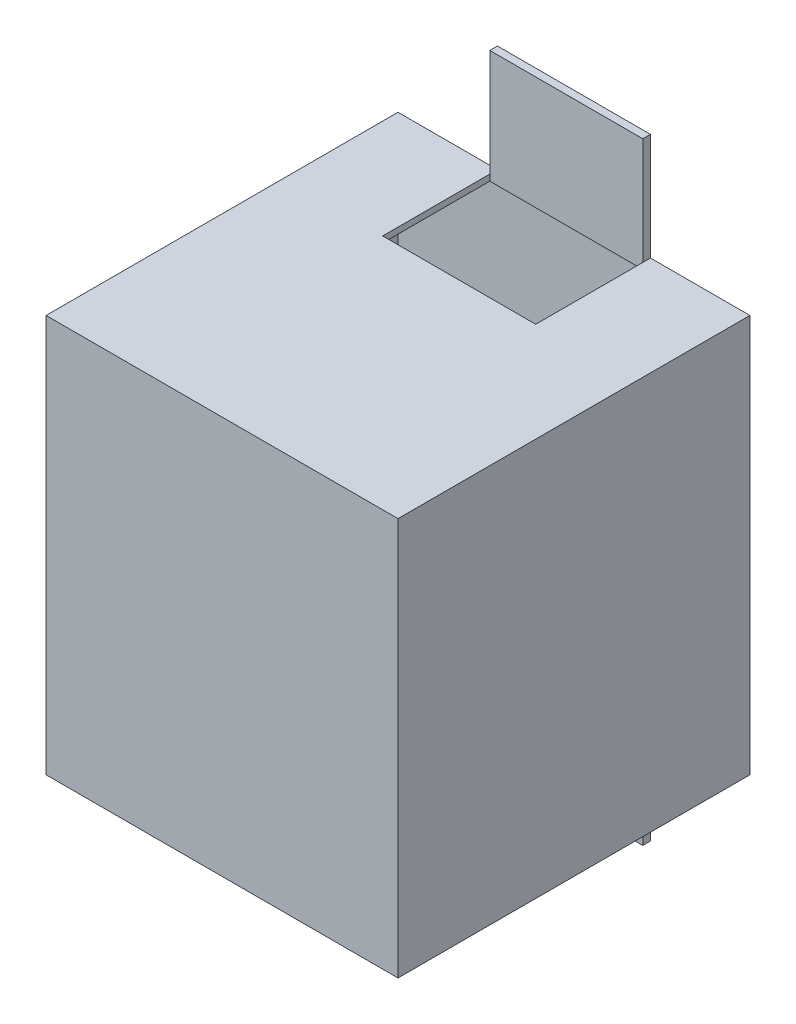
ISO-10303-21;
HEADER;
FILE_DESCRIPTION(('STEP AP214'),'2;1');
FILE_NAME('part.step','',(''),(''),'','','');
FILE_SCHEMA(('AUTOMOTIVE_DESIGN { 1 0 10303 214 1 1 1 1 }'));
ENDSEC;
DATA;
#1=APPLICATION_CONTEXT('core data for automotive mechanical design processes');
#2=APPLICATION_PROTOCOL_DEFINITION('international standard','automotive_design',2000,#1);
#3=PRODUCT_CONTEXT('',#1,'mechanical');
#4=PRODUCT('Part','Part','',(#3));
#5=PRODUCT_RELATED_PRODUCT_CATEGORY('part','',(#4));
#6=PRODUCT_DEFINITION_FORMATION('','',#4);
#7=PRODUCT_DEFINITION_CONTEXT('part definition',#1,'design');
#8=PRODUCT_DEFINITION('design','',#6,#7);
#9=PRODUCT_DEFINITION_SHAPE('','',#8);
#10=(LENGTH_UNIT() NAMED_UNIT(*) SI_UNIT(.MILLI.,.METRE.));
#11=(NAMED_UNIT(*) PLANE_ANGLE_UNIT() SI_UNIT($,.RADIAN.));
#12=(NAMED_UNIT(*) SI_UNIT($,.STERADIAN.) SOLID_ANGLE_UNIT());
#13=UNCERTAINTY_MEASURE_WITH_UNIT(LENGTH_MEASURE(1.E-05),#10,'distance_accuracy_value','');
#14=(GEOMETRIC_REPRESENTATION_CONTEXT(3) GLOBAL_UNCERTAINTY_ASSIGNED_CONTEXT((#13)) GLOBAL_UNIT_ASSIGNED_CONTEXT((#10,
#11,#12)) REPRESENTATION_CONTEXT('',''));
#15=CARTESIAN_POINT('',(0.,0.,0.));
#16=DIRECTION('',(0.,0.,1.));
#17=DIRECTION('',(1.,0.,0.));
#18=AXIS2_PLACEMENT_3D('',#15,#16,#17);
#19=CARTESIAN_POINT('',(0.,0.,230.));
#20=DIRECTION('',(0.,-1.,0.));
#21=DIRECTION('',(0.,0.,-1.));
#22=AXIS2_PLACEMENT_3D('',#19,#20,#21);
#23=PLANE('',#22);
#24=DIRECTION('',(0.,0.,-1.));
#25=VECTOR('',#24,1.);
#26=CARTESIAN_POINT('',(165.,0.,5.));
#27=LINE('',#26,#25);
#28=CARTESIAN_POINT('',(165.,0.,5.));
#29=VERTEX_POINT('',#28);
#30=CARTESIAN_POINT('',(165.,0.,0.));
#31=VERTEX_POINT('',#30);
#32=EDGE_CURVE('E212',#29,#31,#27,.T.);
#33=ORIENTED_EDGE('',*,*,#32,.F.);
#34=DIRECTION('',(0.,0.,1.));
#35=VECTOR('',#34,1.);
#36=CARTESIAN_POINT('',(165.,0.,230.));
#37=LINE('',#36,#35);
#38=CARTESIAN_POINT('',(165.,0.,75.));
#39=VERTEX_POINT('',#38);
#40=EDGE_CURVE('E295',#29,#39,#37,.T.);
#41=ORIENTED_EDGE('',*,*,#40,.T.);
#42=DIRECTION('',(-1.,0.,0.));
#43=VECTOR('',#42,1.);
#44=CARTESIAN_POINT('',(0.,0.,75.));
#45=LINE('',#44,#43);
#46=CARTESIAN_POINT('',(65.,0.,75.));
#47=VERTEX_POINT('',#46);
#48=EDGE_CURVE('E303',#39,#47,#45,.T.);
#49=ORIENTED_EDGE('',*,*,#48,.T.);
#50=DIRECTION('',(0.,0.,-1.));
#51=VECTOR('',#50,1.);
#52=CARTESIAN_POINT('',(65.,0.,230.));
#53=LINE('',#52,#51);
#54=CARTESIAN_POINT('',(65.,0.,5.));
#55=VERTEX_POINT('',#54);
#56=EDGE_CURVE('E311',#47,#55,#53,.T.);
#57=ORIENTED_EDGE('',*,*,#56,.T.);
#58=DIRECTION('',(0.,0.,1.));
#59=VECTOR('',#58,1.);
#60=CARTESIAN_POINT('',(65.,0.,5.));
#61=LINE('',#60,#59);
#62=CARTESIAN_POINT('',(65.,0.,0.));
#63=VERTEX_POINT('',#62);
#64=EDGE_CURVE('E54',#63,#55,#61,.T.);
#65=ORIENTED_EDGE('',*,*,#64,.F.);
#66=DIRECTION('',(-1.,0.,0.));
#67=VECTOR('',#66,1.);
#68=CARTESIAN_POINT('',(0.,0.,0.));
#69=LINE('',#68,#67);
#70=CARTESIAN_POINT('',(0.,0.,0.));
#71=VERTEX_POINT('',#70);
#72=EDGE_CURVE('E380',#63,#71,#69,.T.);
#73=ORIENTED_EDGE('',*,*,#72,.T.);
#74=DIRECTION('',(0.,0.,-1.));
#75=VECTOR('',#74,1.);
#76=CARTESIAN_POINT('',(0.,0.,230.));
#77=LINE('',#76,#75);
#78=CARTESIAN_POINT('',(0.,0.,230.));
#79=VERTEX_POINT('',#78);
#80=EDGE_CURVE('E370',#79,#71,#77,.T.);
#81=ORIENTED_EDGE('',*,*,#80,.F.);
#82=DIRECTION('',(-1.,0.,0.));
#83=VECTOR('',#82,1.);
#84=CARTESIAN_POINT('',(0.,0.,230.));
#85=LINE('',#84,#83);
#86=CARTESIAN_POINT('',(230.,0.,230.));
#87=VERTEX_POINT('',#86);
#88=EDGE_CURVE('E367',#87,#79,#85,.T.);
#89=ORIENTED_EDGE('',*,*,#88,.F.);
#90=DIRECTION('',(0.,0.,-1.));
#91=VECTOR('',#90,1.);
#92=CARTESIAN_POINT('',(230.,0.,230.));
#93=LINE('',#92,#91);
#94=CARTESIAN_POINT('',(230.,0.,0.));
#95=VERTEX_POINT('',#94);
#96=EDGE_CURVE('E386',#87,#95,#93,.T.);
#97=ORIENTED_EDGE('',*,*,#96,.T.);
#98=EDGE_CURVE('E61',#95,#31,#69,.T.);
#99=ORIENTED_EDGE('',*,*,#98,.T.);
#100=EDGE_LOOP('',(#33,#41,#49,#57,#65,#73,#81,#89,#97,#99));
#101=FACE_BOUND('',#100,.T.);
#102=ADVANCED_FACE('F38',(#101),#23,.F.);
#103=CARTESIAN_POINT('',(0.,-260.,230.));
#104=DIRECTION('',(0.,1.,0.));
#105=DIRECTION('',(0.,0.,1.));
#106=AXIS2_PLACEMENT_3D('',#103,#104,#105);
#107=PLANE('',#106);
#108=DIRECTION('',(0.,0.,1.));
#109=VECTOR('',#108,1.);
#110=CARTESIAN_POINT('',(165.,-260.,0.));
#111=LINE('',#110,#109);
#112=CARTESIAN_POINT('',(165.,-260.,0.));
#113=VERTEX_POINT('',#112);
#114=CARTESIAN_POINT('',(165.,-260.,5.));
#115=VERTEX_POINT('',#114);
#116=EDGE_CURVE('E214',#113,#115,#111,.T.);
#117=ORIENTED_EDGE('',*,*,#116,.F.);
#118=DIRECTION('',(1.,0.,0.));
#119=VECTOR('',#118,1.);
#120=CARTESIAN_POINT('',(0.,-260.,0.));
#121=LINE('',#120,#119);
#122=CARTESIAN_POINT('',(230.,-260.,0.));
#123=VERTEX_POINT('',#122);
#124=EDGE_CURVE('E373',#113,#123,#121,.T.);
#125=ORIENTED_EDGE('',*,*,#124,.T.);
#126=DIRECTION('',(0.,0.,-1.));
#127=VECTOR('',#126,1.);
#128=CARTESIAN_POINT('',(230.,-260.,230.));
#129=LINE('',#128,#127);
#130=CARTESIAN_POINT('',(230.,-260.,230.));
#131=VERTEX_POINT('',#130);
#132=EDGE_CURVE('E389',#131,#123,#129,.T.);
#133=ORIENTED_EDGE('',*,*,#132,.F.);
#134=DIRECTION('',(1.,0.,0.));
#135=VECTOR('',#134,1.);
#136=CARTESIAN_POINT('',(0.,-260.,230.));
#137=LINE('',#136,#135);
#138=CARTESIAN_POINT('',(0.,-260.,230.));
#139=VERTEX_POINT('',#138);
#140=EDGE_CURVE('E361',#139,#131,#137,.T.);
#141=ORIENTED_EDGE('',*,*,#140,.F.);
#142=DIRECTION('',(0.,0.,-1.));
#143=VECTOR('',#142,1.);
#144=CARTESIAN_POINT('',(0.,-260.,230.));
#145=LINE('',#144,#143);
#146=CARTESIAN_POINT('',(0.,-260.,0.));
#147=VERTEX_POINT('',#146);
#148=EDGE_CURVE('E393',#139,#147,#145,.T.);
#149=ORIENTED_EDGE('',*,*,#148,.T.);
#150=CARTESIAN_POINT('',(65.,-260.,0.));
#151=VERTEX_POINT('',#150);
#152=EDGE_CURVE('E374',#147,#151,#121,.T.);
#153=ORIENTED_EDGE('',*,*,#152,.T.);
#154=DIRECTION('',(0.,0.,-1.));
#155=VECTOR('',#154,1.);
#156=CARTESIAN_POINT('',(65.,-260.,0.));
#157=LINE('',#156,#155);
#158=CARTESIAN_POINT('',(65.,-260.,5.));
#159=VERTEX_POINT('',#158);
#160=EDGE_CURVE('E220',#159,#151,#157,.T.);
#161=ORIENTED_EDGE('',*,*,#160,.F.);
#162=DIRECTION('',(0.,0.,-1.));
#163=VECTOR('',#162,1.);
#164=CARTESIAN_POINT('',(65.,-260.,75.));
#165=LINE('',#164,#163);
#166=CARTESIAN_POINT('',(65.,-260.,75.));
#167=VERTEX_POINT('',#166);
#168=EDGE_CURVE('E258',#167,#159,#165,.T.);
#169=ORIENTED_EDGE('',*,*,#168,.F.);
#170=DIRECTION('',(-1.,0.,0.));
#171=VECTOR('',#170,1.);
#172=CARTESIAN_POINT('',(65.,-260.,75.));
#173=LINE('',#172,#171);
#174=CARTESIAN_POINT('',(165.,-260.,75.));
#175=VERTEX_POINT('',#174);
#176=EDGE_CURVE('E266',#175,#167,#173,.T.);
#177=ORIENTED_EDGE('',*,*,#176,.F.);
#178=DIRECTION('',(0.,0.,1.));
#179=VECTOR('',#178,1.);
#180=CARTESIAN_POINT('',(165.,-260.,75.));
#181=LINE('',#180,#179);
#182=EDGE_CURVE('E262',#115,#175,#181,.T.);
#183=ORIENTED_EDGE('',*,*,#182,.F.);
#184=EDGE_LOOP('',(#117,#125,#133,#141,#149,#153,#161,#169,#177,#183));
#185=FACE_BOUND('',#184,.T.);
#186=ADVANCED_FACE('F504',(#185),#107,.F.);
#187=CARTESIAN_POINT('',(0.,-256.,0.));
#188=DIRECTION('',(0.,-1.,0.));
#189=DIRECTION('',(0.,0.,-1.));
#190=AXIS2_PLACEMENT_3D('',#187,#188,#189);
#191=PLANE('',#190);
#192=DIRECTION('',(-1.,0.,0.));
#193=VECTOR('',#192,1.);
#194=CARTESIAN_POINT('',(0.,-256.,75.));
#195=LINE('',#194,#193);
#196=CARTESIAN_POINT('',(165.,-256.,75.));
#197=VERTEX_POINT('',#196);
#198=CARTESIAN_POINT('',(65.,-256.,75.));
#199=VERTEX_POINT('',#198);
#200=EDGE_CURVE('E299',#197,#199,#195,.T.);
#201=ORIENTED_EDGE('',*,*,#200,.T.);
#202=DIRECTION('',(0.,0.,-1.));
#203=VECTOR('',#202,1.);
#204=CARTESIAN_POINT('',(65.,-256.,0.));
#205=LINE('',#204,#203);
#206=CARTESIAN_POINT('',(65.,-256.,5.));
#207=VERTEX_POINT('',#206);
#208=EDGE_CURVE('E307',#199,#207,#205,.T.);
#209=ORIENTED_EDGE('',*,*,#208,.T.);
#210=DIRECTION('',(1.,0.,0.));
#211=VECTOR('',#210,1.);
#212=CARTESIAN_POINT('',(0.,-256.,5.));
#213=LINE('',#212,#211);
#214=CARTESIAN_POINT('',(165.,-256.,5.));
#215=VERTEX_POINT('',#214);
#216=EDGE_CURVE('E287',#207,#215,#213,.T.);
#217=ORIENTED_EDGE('',*,*,#216,.T.);
#218=DIRECTION('',(0.,0.,1.));
#219=VECTOR('',#218,1.);
#220=CARTESIAN_POINT('',(165.,-256.,0.));
#221=LINE('',#220,#219);
#222=EDGE_CURVE('E291',#215,#197,#221,.T.);
#223=ORIENTED_EDGE('',*,*,#222,.T.);
#224=EDGE_LOOP('',(#201,#209,#217,#223));
#225=FACE_BOUND('',#224,.T.);
#226=DIRECTION('',(1.,0.,0.));
#227=VECTOR('',#226,1.);
#228=CARTESIAN_POINT('',(226.,-256.,226.));
#229=LINE('',#228,#227);
#230=CARTESIAN_POINT('',(4.00000000000003,-256.,226.));
#231=VERTEX_POINT('',#230);
#232=CARTESIAN_POINT('',(226.,-256.,226.));
#233=VERTEX_POINT('',#232);
#234=EDGE_CURVE('E397',#231,#233,#229,.T.);
#235=ORIENTED_EDGE('',*,*,#234,.T.);
#236=DIRECTION('',(0.,0.,-1.));
#237=VECTOR('',#236,1.);
#238=CARTESIAN_POINT('',(226.,-256.,4.));
#239=LINE('',#238,#237);
#240=CARTESIAN_POINT('',(226.,-256.,4.));
#241=VERTEX_POINT('',#240);
#242=EDGE_CURVE('E322',#233,#241,#239,.T.);
#243=ORIENTED_EDGE('',*,*,#242,.T.);
#244=DIRECTION('',(-1.,0.,0.));
#245=VECTOR('',#244,1.);
#246=CARTESIAN_POINT('',(226.,-256.,4.));
#247=LINE('',#246,#245);
#248=CARTESIAN_POINT('',(4.00000000000003,-256.,3.99999999999997));
#249=VERTEX_POINT('',#248);
#250=EDGE_CURVE('E318',#241,#249,#247,.T.);
#251=ORIENTED_EDGE('',*,*,#250,.T.);
#252=DIRECTION('',(0.,0.,1.));
#253=VECTOR('',#252,1.);
#254=CARTESIAN_POINT('',(4.00000000000003,-256.,3.99999999999997));
#255=LINE('',#254,#253);
#256=EDGE_CURVE('E314',#249,#231,#255,.T.);
#257=ORIENTED_EDGE('',*,*,#256,.T.);
#258=EDGE_LOOP('',(#235,#243,#251,#257));
#259=FACE_BOUND('',#258,.T.);
#260=ADVANCED_FACE('F528',(#225,#259),#191,.F.);
#261=CARTESIAN_POINT('',(0.,-4.,0.));
#262=DIRECTION('',(0.,-1.,0.));
#263=DIRECTION('',(0.,0.,-1.));
#264=AXIS2_PLACEMENT_3D('',#261,#262,#263);
#265=PLANE('',#264);
#266=DIRECTION('',(0.,0.,-1.));
#267=VECTOR('',#266,1.);
#268=CARTESIAN_POINT('',(65.,-4.,0.));
#269=LINE('',#268,#267);
#270=CARTESIAN_POINT('',(65.,-4.,75.));
#271=VERTEX_POINT('',#270);
#272=CARTESIAN_POINT('',(65.,-4.,5.));
#273=VERTEX_POINT('',#272);
#274=EDGE_CURVE('E11',#271,#273,#269,.T.);
#275=ORIENTED_EDGE('',*,*,#274,.F.);
#276=DIRECTION('',(-1.,0.,0.));
#277=VECTOR('',#276,1.);
#278=CARTESIAN_POINT('',(0.,-4.,75.));
#279=LINE('',#278,#277);
#280=CARTESIAN_POINT('',(165.,-4.,75.));
#281=VERTEX_POINT('',#280);
#282=EDGE_CURVE('E47',#281,#271,#279,.T.);
#283=ORIENTED_EDGE('',*,*,#282,.F.);
#284=DIRECTION('',(0.,0.,1.));
#285=VECTOR('',#284,1.);
#286=CARTESIAN_POINT('',(165.,-4.,0.));
#287=LINE('',#286,#285);
#288=CARTESIAN_POINT('',(165.,-4.,5.));
#289=VERTEX_POINT('',#288);
#290=EDGE_CURVE('E404',#289,#281,#287,.T.);
#291=ORIENTED_EDGE('',*,*,#290,.F.);
#292=DIRECTION('',(1.,0.,0.));
#293=VECTOR('',#292,1.);
#294=CARTESIAN_POINT('',(0.,-4.,5.));
#295=LINE('',#294,#293);
#296=EDGE_CURVE('E401',#273,#289,#295,.T.);
#297=ORIENTED_EDGE('',*,*,#296,.F.);
#298=EDGE_LOOP('',(#275,#283,#291,#297));
#299=FACE_BOUND('',#298,.T.);
#300=DIRECTION('',(0.,0.,1.));
#301=VECTOR('',#300,1.);
#302=CARTESIAN_POINT('',(226.,-4.,4.));
#303=LINE('',#302,#301);
#304=CARTESIAN_POINT('',(226.,-4.,4.));
#305=VERTEX_POINT('',#304);
#306=CARTESIAN_POINT('',(226.,-4.,226.));
#307=VERTEX_POINT('',#306);
#308=EDGE_CURVE('E326',#305,#307,#303,.T.);
#309=ORIENTED_EDGE('',*,*,#308,.T.);
#310=DIRECTION('',(-1.,0.,0.));
#311=VECTOR('',#310,1.);
#312=CARTESIAN_POINT('',(226.,-4.,226.));
#313=LINE('',#312,#311);
#314=CARTESIAN_POINT('',(4.00000000000003,-4.,226.));
#315=VERTEX_POINT('',#314);
#316=EDGE_CURVE('E330',#307,#315,#313,.T.);
#317=ORIENTED_EDGE('',*,*,#316,.T.);
#318=DIRECTION('',(0.,0.,-1.));
#319=VECTOR('',#318,1.);
#320=CARTESIAN_POINT('',(4.00000000000003,-4.,3.99999999999997));
#321=LINE('',#320,#319);
#322=CARTESIAN_POINT('',(4.00000000000003,-4.,3.99999999999997));
#323=VERTEX_POINT('',#322);
#324=EDGE_CURVE('E334',#315,#323,#321,.T.);
#325=ORIENTED_EDGE('',*,*,#324,.T.);
#326=DIRECTION('',(1.,0.,0.));
#327=VECTOR('',#326,1.);
#328=CARTESIAN_POINT('',(226.,-4.,4.));
#329=LINE('',#328,#327);
#330=EDGE_CURVE('E338',#323,#305,#329,.T.);
#331=ORIENTED_EDGE('',*,*,#330,.T.);
#332=EDGE_LOOP('',(#309,#317,#325,#331));
#333=FACE_BOUND('',#332,.T.);
#334=ADVANCED_FACE('F423',(#299,#333),#265,.T.);
#335=CARTESIAN_POINT('',(226.,-4.,226.));
#336=DIRECTION('',(0.,0.,1.));
#337=DIRECTION('',(1.,0.,0.));
#338=AXIS2_PLACEMENT_3D('',#335,#336,#337);
#339=PLANE('',#338);
#340=ORIENTED_EDGE('',*,*,#234,.F.);
#341=DIRECTION('',(0.,-1.,0.));
#342=VECTOR('',#341,1.);
#343=CARTESIAN_POINT('',(4.00000000000003,-4.,226.));
#344=LINE('',#343,#342);
#345=EDGE_CURVE('E352',#315,#231,#344,.T.);
#346=ORIENTED_EDGE('',*,*,#345,.F.);
#347=ORIENTED_EDGE('',*,*,#316,.F.);
#348=DIRECTION('',(0.,-1.,0.));
#349=VECTOR('',#348,1.);
#350=CARTESIAN_POINT('',(226.,-4.,226.));
#351=LINE('',#350,#349);
#352=EDGE_CURVE('E342',#307,#233,#351,.T.);
#353=ORIENTED_EDGE('',*,*,#352,.T.);
#354=EDGE_LOOP('',(#340,#346,#347,#353));
#355=FACE_BOUND('',#354,.T.);
#356=ADVANCED_FACE('F538',(#355),#339,.F.);
#357=CARTESIAN_POINT('',(4.00000000000003,-4.,3.99999999999997));
#358=DIRECTION('',(-1.,0.,0.));
#359=DIRECTION('',(0.,0.,1.));
#360=AXIS2_PLACEMENT_3D('',#357,#358,#359);
#361=PLANE('',#360);
#362=ORIENTED_EDGE('',*,*,#256,.F.);
#363=DIRECTION('',(0.,-1.,0.));
#364=VECTOR('',#363,1.);
#365=CARTESIAN_POINT('',(4.00000000000003,-4.,3.99999999999997));
#366=LINE('',#365,#364);
#367=EDGE_CURVE('E348',#323,#249,#366,.T.);
#368=ORIENTED_EDGE('',*,*,#367,.F.);
#369=ORIENTED_EDGE('',*,*,#324,.F.);
#370=ORIENTED_EDGE('',*,*,#345,.T.);
#371=EDGE_LOOP('',(#362,#368,#369,#370));
#372=FACE_BOUND('',#371,.T.);
#373=ADVANCED_FACE('F541',(#372),#361,.F.);
#374=CARTESIAN_POINT('',(226.,-4.,4.));
#375=DIRECTION('',(0.,0.,-1.));
#376=DIRECTION('',(-1.,0.,0.));
#377=AXIS2_PLACEMENT_3D('',#374,#375,#376);
#378=PLANE('',#377);
#379=ORIENTED_EDGE('',*,*,#250,.F.);
#380=DIRECTION('',(0.,-1.,0.));
#381=VECTOR('',#380,1.);
#382=CARTESIAN_POINT('',(226.,-4.,4.));
#383=LINE('',#382,#381);
#384=EDGE_CURVE('E343',#305,#241,#383,.T.);
#385=ORIENTED_EDGE('',*,*,#384,.F.);
#386=ORIENTED_EDGE('',*,*,#330,.F.);
#387=ORIENTED_EDGE('',*,*,#367,.T.);
#388=EDGE_LOOP('',(#379,#385,#386,#387));
#389=FACE_BOUND('',#388,.T.);
#390=ADVANCED_FACE('F536',(#389),#378,.F.);
#391=CARTESIAN_POINT('',(226.,-4.,4.));
#392=DIRECTION('',(1.,0.,0.));
#393=DIRECTION('',(0.,0.,-1.));
#394=AXIS2_PLACEMENT_3D('',#391,#392,#393);
#395=PLANE('',#394);
#396=ORIENTED_EDGE('',*,*,#242,.F.);
#397=ORIENTED_EDGE('',*,*,#352,.F.);
#398=ORIENTED_EDGE('',*,*,#308,.F.);
#399=ORIENTED_EDGE('',*,*,#384,.T.);
#400=EDGE_LOOP('',(#396,#397,#398,#399));
#401=FACE_BOUND('',#400,.T.);
#402=ADVANCED_FACE('F533',(#401),#395,.F.);
#403=CARTESIAN_POINT('',(65.,196.,5.));
#404=DIRECTION('',(0.,0.,-1.));
#405=DIRECTION('',(-1.,0.,0.));
#406=AXIS2_PLACEMENT_3D('',#403,#404,#405);
#407=PLANE('',#406);
#408=DIRECTION('',(0.,-1.,0.));
#409=VECTOR('',#408,1.);
#410=CARTESIAN_POINT('',(65.,196.,5.));
#411=LINE('',#410,#409);
#412=EDGE_CURVE('E283',#55,#273,#411,.T.);
#413=ORIENTED_EDGE('',*,*,#412,.T.);
#414=ORIENTED_EDGE('',*,*,#296,.T.);
#415=DIRECTION('',(0.,-1.,0.));
#416=VECTOR('',#415,1.);
#417=CARTESIAN_POINT('',(165.,196.,5.));
#418=LINE('',#417,#416);
#419=EDGE_CURVE('E279',#29,#289,#418,.T.);
#420=ORIENTED_EDGE('',*,*,#419,.F.);
#421=DIRECTION('',(0.,-1.,0.));
#422=VECTOR('',#421,1.);
#423=CARTESIAN_POINT('',(165.,70.,5.));
#424=LINE('',#423,#422);
#425=CARTESIAN_POINT('',(165.,70.,5.));
#426=VERTEX_POINT('',#425);
#427=EDGE_CURVE('E831',#426,#29,#424,.T.);
#428=ORIENTED_EDGE('',*,*,#427,.F.);
#429=DIRECTION('',(1.,0.,0.));
#430=VECTOR('',#429,1.);
#431=CARTESIAN_POINT('',(165.,70.,5.));
#432=LINE('',#431,#430);
#433=CARTESIAN_POINT('',(65.,70.,5.));
#434=VERTEX_POINT('',#433);
#435=EDGE_CURVE('E205',#434,#426,#432,.T.);
#436=ORIENTED_EDGE('',*,*,#435,.F.);
#437=DIRECTION('',(0.,-1.,0.));
#438=VECTOR('',#437,1.);
#439=CARTESIAN_POINT('',(65.,70.,5.));
#440=LINE('',#439,#438);
#441=EDGE_CURVE('E222',#434,#55,#440,.T.);
#442=ORIENTED_EDGE('',*,*,#441,.T.);
#443=EDGE_LOOP('',(#413,#414,#420,#428,#436,#442));
#444=FACE_BOUND('',#443,.T.);
#445=ADVANCED_FACE('F428',(#444),#407,.F.);
#446=CARTESIAN_POINT('',(165.,196.,75.));
#447=DIRECTION('',(1.,0.,0.));
#448=DIRECTION('',(0.,0.,-1.));
#449=AXIS2_PLACEMENT_3D('',#446,#447,#448);
#450=PLANE('',#449);
#451=ORIENTED_EDGE('',*,*,#419,.T.);
#452=ORIENTED_EDGE('',*,*,#290,.T.);
#453=DIRECTION('',(0.,-1.,0.));
#454=VECTOR('',#453,1.);
#455=CARTESIAN_POINT('',(165.,196.,75.));
#456=LINE('',#455,#454);
#457=EDGE_CURVE('E275',#39,#281,#456,.T.);
#458=ORIENTED_EDGE('',*,*,#457,.F.);
#459=ORIENTED_EDGE('',*,*,#40,.F.);
#460=EDGE_LOOP('',(#451,#452,#458,#459));
#461=FACE_BOUND('',#460,.T.);
#462=ADVANCED_FACE('F432',(#461),#450,.F.);
#463=CARTESIAN_POINT('',(65.,196.,75.));
#464=DIRECTION('',(0.,0.,1.));
#465=DIRECTION('',(1.,0.,0.));
#466=AXIS2_PLACEMENT_3D('',#463,#464,#465);
#467=PLANE('',#466);
#468=ORIENTED_EDGE('',*,*,#457,.T.);
#469=ORIENTED_EDGE('',*,*,#282,.T.);
#470=DIRECTION('',(0.,-1.,0.));
#471=VECTOR('',#470,1.);
#472=CARTESIAN_POINT('',(65.,196.,75.));
#473=LINE('',#472,#471);
#474=EDGE_CURVE('E274',#47,#271,#473,.T.);
#475=ORIENTED_EDGE('',*,*,#474,.F.);
#476=ORIENTED_EDGE('',*,*,#48,.F.);
#477=EDGE_LOOP('',(#468,#469,#475,#476));
#478=FACE_BOUND('',#477,.T.);
#479=ADVANCED_FACE('F413',(#478),#467,.F.);
#480=CARTESIAN_POINT('',(65.,196.,75.));
#481=DIRECTION('',(-1.,0.,0.));
#482=DIRECTION('',(0.,0.,1.));
#483=AXIS2_PLACEMENT_3D('',#480,#481,#482);
#484=PLANE('',#483);
#485=ORIENTED_EDGE('',*,*,#474,.T.);
#486=ORIENTED_EDGE('',*,*,#274,.T.);
#487=ORIENTED_EDGE('',*,*,#412,.F.);
#488=ORIENTED_EDGE('',*,*,#56,.F.);
#489=EDGE_LOOP('',(#485,#486,#487,#488));
#490=FACE_BOUND('',#489,.T.);
#491=ADVANCED_FACE('F419',(#490),#484,.F.);
#492=EDGE_CURVE('E271',#199,#167,#473,.T.);
#493=ORIENTED_EDGE('',*,*,#492,.T.);
#494=ORIENTED_EDGE('',*,*,#168,.T.);
#495=EDGE_CURVE('E270',#207,#159,#411,.T.);
#496=ORIENTED_EDGE('',*,*,#495,.F.);
#497=ORIENTED_EDGE('',*,*,#208,.F.);
#498=EDGE_LOOP('',(#493,#494,#496,#497));
#499=FACE_BOUND('',#498,.T.);
#500=ADVANCED_FACE('F556',(#499),#484,.F.);
#501=EDGE_CURVE('E276',#197,#175,#456,.T.);
#502=ORIENTED_EDGE('',*,*,#501,.T.);
#503=ORIENTED_EDGE('',*,*,#176,.T.);
#504=ORIENTED_EDGE('',*,*,#492,.F.);
#505=ORIENTED_EDGE('',*,*,#200,.F.);
#506=EDGE_LOOP('',(#502,#503,#504,#505));
#507=FACE_BOUND('',#506,.T.);
#508=ADVANCED_FACE('F564',(#507),#467,.F.);
#509=EDGE_CURVE('E280',#215,#115,#418,.T.);
#510=ORIENTED_EDGE('',*,*,#509,.T.);
#511=ORIENTED_EDGE('',*,*,#182,.T.);
#512=ORIENTED_EDGE('',*,*,#501,.F.);
#513=ORIENTED_EDGE('',*,*,#222,.F.);
#514=EDGE_LOOP('',(#510,#511,#512,#513));
#515=FACE_BOUND('',#514,.T.);
#516=ADVANCED_FACE('F561',(#515),#450,.F.);
#517=ORIENTED_EDGE('',*,*,#495,.T.);
#518=DIRECTION('',(0.,1.,0.));
#519=VECTOR('',#518,1.);
#520=CARTESIAN_POINT('',(65.,-330.,5.));
#521=LINE('',#520,#519);
#522=CARTESIAN_POINT('',(65.,-330.,5.));
#523=VERTEX_POINT('',#522);
#524=EDGE_CURVE('E250',#523,#159,#521,.T.);
#525=ORIENTED_EDGE('',*,*,#524,.F.);
#526=DIRECTION('',(-1.,0.,0.));
#527=VECTOR('',#526,1.);
#528=CARTESIAN_POINT('',(165.,-330.,5.));
#529=LINE('',#528,#527);
#530=CARTESIAN_POINT('',(165.,-330.,5.));
#531=VERTEX_POINT('',#530);
#532=EDGE_CURVE('E230',#531,#523,#529,.T.);
#533=ORIENTED_EDGE('',*,*,#532,.F.);
#534=DIRECTION('',(0.,1.,0.));
#535=VECTOR('',#534,1.);
#536=CARTESIAN_POINT('',(165.,-330.,5.));
#537=LINE('',#536,#535);
#538=EDGE_CURVE('E254',#531,#115,#537,.T.);
#539=ORIENTED_EDGE('',*,*,#538,.T.);
#540=ORIENTED_EDGE('',*,*,#509,.F.);
#541=ORIENTED_EDGE('',*,*,#216,.F.);
#542=EDGE_LOOP('',(#517,#525,#533,#539,#540,#541));
#543=FACE_BOUND('',#542,.T.);
#544=ADVANCED_FACE('F522',(#543),#407,.F.);
#545=CARTESIAN_POINT('',(0.,0.,230.));
#546=DIRECTION('',(1.,0.,0.));
#547=DIRECTION('',(0.,1.,0.));
#548=AXIS2_PLACEMENT_3D('',#545,#546,#547);
#549=PLANE('',#548);
#550=ORIENTED_EDGE('',*,*,#148,.F.);
#551=DIRECTION('',(0.,-1.,0.));
#552=VECTOR('',#551,1.);
#553=CARTESIAN_POINT('',(0.,0.,230.));
#554=LINE('',#553,#552);
#555=EDGE_CURVE('E358',#79,#139,#554,.T.);
#556=ORIENTED_EDGE('',*,*,#555,.F.);
#557=ORIENTED_EDGE('',*,*,#80,.T.);
#558=DIRECTION('',(0.,-1.,0.));
#559=VECTOR('',#558,1.);
#560=CARTESIAN_POINT('',(0.,0.,0.));
#561=LINE('',#560,#559);
#562=EDGE_CURVE('E347',#71,#147,#561,.T.);
#563=ORIENTED_EDGE('',*,*,#562,.T.);
#564=EDGE_LOOP('',(#550,#556,#557,#563));
#565=FACE_BOUND('',#564,.T.);
#566=ADVANCED_FACE('F40',(#565),#549,.F.);
#567=CARTESIAN_POINT('',(230.,0.,230.));
#568=DIRECTION('',(-1.,0.,0.));
#569=DIRECTION('',(0.,0.,1.));
#570=AXIS2_PLACEMENT_3D('',#567,#568,#569);
#571=PLANE('',#570);
#572=DIRECTION('',(0.,1.,0.));
#573=VECTOR('',#572,1.);
#574=CARTESIAN_POINT('',(230.,0.,0.));
#575=LINE('',#574,#573);
#576=EDGE_CURVE('E377',#123,#95,#575,.T.);
#577=ORIENTED_EDGE('',*,*,#576,.T.);
#578=ORIENTED_EDGE('',*,*,#96,.F.);
#579=DIRECTION('',(0.,1.,0.));
#580=VECTOR('',#579,1.);
#581=CARTESIAN_POINT('',(230.,0.,230.));
#582=LINE('',#581,#580);
#583=EDGE_CURVE('E364',#131,#87,#582,.T.);
#584=ORIENTED_EDGE('',*,*,#583,.F.);
#585=ORIENTED_EDGE('',*,*,#132,.T.);
#586=EDGE_LOOP('',(#577,#578,#584,#585));
#587=FACE_BOUND('',#586,.T.);
#588=ADVANCED_FACE('F514',(#587),#571,.F.);
#589=CARTESIAN_POINT('',(0.,0.,230.));
#590=DIRECTION('',(0.,0.,1.));
#591=DIRECTION('',(1.,0.,0.));
#592=AXIS2_PLACEMENT_3D('',#589,#590,#591);
#593=PLANE('',#592);
#594=ORIENTED_EDGE('',*,*,#583,.T.);
#595=ORIENTED_EDGE('',*,*,#88,.T.);
#596=ORIENTED_EDGE('',*,*,#555,.T.);
#597=ORIENTED_EDGE('',*,*,#140,.T.);
#598=EDGE_LOOP('',(#594,#595,#596,#597));
#599=FACE_BOUND('',#598,.T.);
#600=ADVANCED_FACE('F508',(#599),#593,.T.);
#601=CARTESIAN_POINT('',(0.,0.,0.));
#602=DIRECTION('',(0.,0.,1.));
#603=DIRECTION('',(1.,0.,0.));
#604=AXIS2_PLACEMENT_3D('',#601,#602,#603);
#605=PLANE('',#604);
#606=ORIENTED_EDGE('',*,*,#152,.F.);
#607=ORIENTED_EDGE('',*,*,#562,.F.);
#608=ORIENTED_EDGE('',*,*,#72,.F.);
#609=DIRECTION('',(0.,-1.,0.));
#610=VECTOR('',#609,1.);
#611=CARTESIAN_POINT('',(65.,70.,0.));
#612=LINE('',#611,#610);
#613=CARTESIAN_POINT('',(65.,70.,0.));
#614=VERTEX_POINT('',#613);
#615=EDGE_CURVE('E195',#614,#63,#612,.T.);
#616=ORIENTED_EDGE('',*,*,#615,.F.);
#617=DIRECTION('',(-1.,0.,0.));
#618=VECTOR('',#617,1.);
#619=CARTESIAN_POINT('',(165.,70.,0.));
#620=LINE('',#619,#618);
#621=CARTESIAN_POINT('',(165.,70.,0.));
#622=VERTEX_POINT('',#621);
#623=EDGE_CURVE('E187',#622,#614,#620,.T.);
#624=ORIENTED_EDGE('',*,*,#623,.F.);
#625=DIRECTION('',(0.,-1.,0.));
#626=VECTOR('',#625,1.);
#627=CARTESIAN_POINT('',(165.,70.,0.));
#628=LINE('',#627,#626);
#629=EDGE_CURVE('E192',#622,#31,#628,.T.);
#630=ORIENTED_EDGE('',*,*,#629,.T.);
#631=ORIENTED_EDGE('',*,*,#98,.F.);
#632=ORIENTED_EDGE('',*,*,#576,.F.);
#633=ORIENTED_EDGE('',*,*,#124,.F.);
#634=DIRECTION('',(0.,1.,0.));
#635=VECTOR('',#634,1.);
#636=CARTESIAN_POINT('',(165.,-330.,0.));
#637=LINE('',#636,#635);
#638=CARTESIAN_POINT('',(165.,-330.,0.));
#639=VERTEX_POINT('',#638);
#640=EDGE_CURVE('E238',#639,#113,#637,.T.);
#641=ORIENTED_EDGE('',*,*,#640,.F.);
#642=DIRECTION('',(1.,0.,0.));
#643=VECTOR('',#642,1.);
#644=CARTESIAN_POINT('',(165.,-330.,0.));
#645=LINE('',#644,#643);
#646=CARTESIAN_POINT('',(65.,-330.,0.));
#647=VERTEX_POINT('',#646);
#648=EDGE_CURVE('E236',#647,#639,#645,.T.);
#649=ORIENTED_EDGE('',*,*,#648,.F.);
#650=DIRECTION('',(0.,1.,0.));
#651=VECTOR('',#650,1.);
#652=CARTESIAN_POINT('',(65.,-330.,0.));
#653=LINE('',#652,#651);
#654=EDGE_CURVE('E246',#647,#151,#653,.T.);
#655=ORIENTED_EDGE('',*,*,#654,.T.);
#656=EDGE_LOOP('',(#606,#607,#608,#616,#624,#630,#631,#632,#633,#641,#649,#655));
#657=FACE_BOUND('',#656,.T.);
#658=ADVANCED_FACE('F190',(#657),#605,.F.);
#659=CARTESIAN_POINT('',(165.,-330.,0.));
#660=DIRECTION('',(-1.,0.,0.));
#661=DIRECTION('',(0.,0.,1.));
#662=AXIS2_PLACEMENT_3D('',#659,#660,#661);
#663=PLANE('',#662);
#664=ORIENTED_EDGE('',*,*,#116,.T.);
#665=ORIENTED_EDGE('',*,*,#538,.F.);
#666=DIRECTION('',(0.,0.,1.));
#667=VECTOR('',#666,1.);
#668=CARTESIAN_POINT('',(165.,-330.,0.));
#669=LINE('',#668,#667);
#670=EDGE_CURVE('E226',#639,#531,#669,.T.);
#671=ORIENTED_EDGE('',*,*,#670,.F.);
#672=ORIENTED_EDGE('',*,*,#640,.T.);
#673=EDGE_LOOP('',(#664,#665,#671,#672));
#674=FACE_BOUND('',#673,.T.);
#675=ADVANCED_FACE('F531',(#674),#663,.F.);
#676=CARTESIAN_POINT('',(65.,-330.,0.));
#677=DIRECTION('',(1.,0.,0.));
#678=DIRECTION('',(0.,0.,-1.));
#679=AXIS2_PLACEMENT_3D('',#676,#677,#678);
#680=PLANE('',#679);
#681=ORIENTED_EDGE('',*,*,#160,.T.);
#682=ORIENTED_EDGE('',*,*,#654,.F.);
#683=DIRECTION('',(0.,0.,-1.));
#684=VECTOR('',#683,1.);
#685=CARTESIAN_POINT('',(65.,-330.,0.));
#686=LINE('',#685,#684);
#687=EDGE_CURVE('E233',#523,#647,#686,.T.);
#688=ORIENTED_EDGE('',*,*,#687,.F.);
#689=ORIENTED_EDGE('',*,*,#524,.T.);
#690=EDGE_LOOP('',(#681,#682,#688,#689));
#691=FACE_BOUND('',#690,.T.);
#692=ADVANCED_FACE('F567',(#691),#680,.F.);
#693=CARTESIAN_POINT('',(0.,-330.,0.));
#694=DIRECTION('',(0.,-1.,0.));
#695=DIRECTION('',(0.,0.,-1.));
#696=AXIS2_PLACEMENT_3D('',#693,#694,#695);
#697=PLANE('',#696);
#698=ORIENTED_EDGE('',*,*,#670,.T.);
#699=ORIENTED_EDGE('',*,*,#532,.T.);
#700=ORIENTED_EDGE('',*,*,#687,.T.);
#701=ORIENTED_EDGE('',*,*,#648,.T.);
#702=EDGE_LOOP('',(#698,#699,#700,#701));
#703=FACE_BOUND('',#702,.T.);
#704=ADVANCED_FACE('F571',(#703),#697,.T.);
#705=CARTESIAN_POINT('',(165.,70.,5.));
#706=DIRECTION('',(-1.,0.,0.));
#707=DIRECTION('',(0.,0.,1.));
#708=AXIS2_PLACEMENT_3D('',#705,#706,#707);
#709=PLANE('',#708);
#710=ORIENTED_EDGE('',*,*,#32,.T.);
#711=ORIENTED_EDGE('',*,*,#629,.F.);
#712=DIRECTION('',(0.,0.,-1.));
#713=VECTOR('',#712,1.);
#714=CARTESIAN_POINT('',(165.,70.,5.));
#715=LINE('',#714,#713);
#716=EDGE_CURVE('E200',#426,#622,#715,.T.);
#717=ORIENTED_EDGE('',*,*,#716,.F.);
#718=ORIENTED_EDGE('',*,*,#427,.T.);
#719=EDGE_LOOP('',(#710,#711,#717,#718));
#720=FACE_BOUND('',#719,.T.);
#721=ADVANCED_FACE('F211',(#720),#709,.F.);
#722=CARTESIAN_POINT('',(65.,70.,5.));
#723=DIRECTION('',(1.,0.,0.));
#724=DIRECTION('',(0.,0.,-1.));
#725=AXIS2_PLACEMENT_3D('',#722,#723,#724);
#726=PLANE('',#725);
#727=ORIENTED_EDGE('',*,*,#64,.T.);
#728=ORIENTED_EDGE('',*,*,#441,.F.);
#729=DIRECTION('',(0.,0.,1.));
#730=VECTOR('',#729,1.);
#731=CARTESIAN_POINT('',(65.,70.,5.));
#732=LINE('',#731,#730);
#733=EDGE_CURVE('E199',#614,#434,#732,.T.);
#734=ORIENTED_EDGE('',*,*,#733,.F.);
#735=ORIENTED_EDGE('',*,*,#615,.T.);
#736=EDGE_LOOP('',(#727,#728,#734,#735));
#737=FACE_BOUND('',#736,.T.);
#738=ADVANCED_FACE('F578',(#737),#726,.F.);
#739=CARTESIAN_POINT('',(0.,70.,0.));
#740=DIRECTION('',(0.,1.,0.));
#741=DIRECTION('',(0.,0.,1.));
#742=AXIS2_PLACEMENT_3D('',#739,#740,#741);
#743=PLANE('',#742);
#744=ORIENTED_EDGE('',*,*,#716,.T.);
#745=ORIENTED_EDGE('',*,*,#623,.T.);
#746=ORIENTED_EDGE('',*,*,#733,.T.);
#747=ORIENTED_EDGE('',*,*,#435,.T.);
#748=EDGE_LOOP('',(#744,#745,#746,#747));
#749=FACE_BOUND('',#748,.T.);
#750=ADVANCED_FACE('F203',(#749),#743,.T.);
#751=CLOSED_SHELL('',(#102,#186,#260,#334,#356,#373,#390,#402,#445,#462,#479,#491,#500,#508,
#516,#544,#566,#588,#600,#658,#675,#692,#704,#721,#738,#750));
#752=MANIFOLD_SOLID_BREP('B2',#751);
#753=ADVANCED_BREP_SHAPE_REPRESENTATION('',(#18,#752),#14);
#754=SHAPE_DEFINITION_REPRESENTATION(#9,#753);
ENDSEC;
END-ISO-10303-21;
